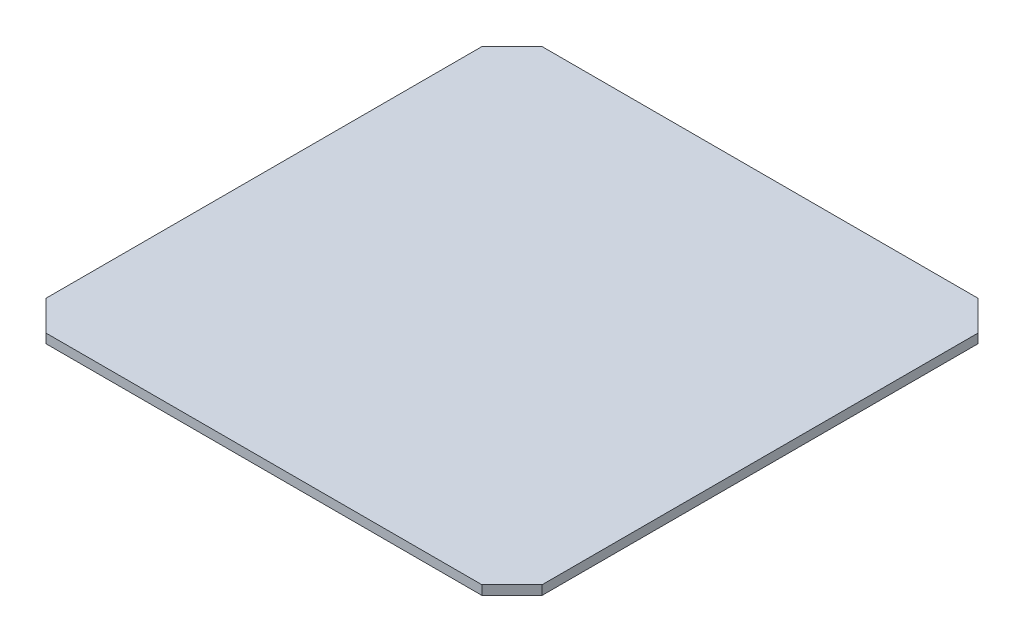
ISO-10303-21;
HEADER;
FILE_DESCRIPTION(('STEP AP214'),'2;1');
FILE_NAME('part.step','',(''),(''),'','','');
FILE_SCHEMA(('AUTOMOTIVE_DESIGN { 1 0 10303 214 1 1 1 1 }'));
ENDSEC;
DATA;
#1=APPLICATION_CONTEXT('core data for automotive mechanical design processes');
#2=APPLICATION_PROTOCOL_DEFINITION('international standard','automotive_design',2000,#1);
#3=PRODUCT_CONTEXT('',#1,'mechanical');
#4=PRODUCT('Part','Part','',(#3));
#5=PRODUCT_RELATED_PRODUCT_CATEGORY('part','',(#4));
#6=PRODUCT_DEFINITION_FORMATION('','',#4);
#7=PRODUCT_DEFINITION_CONTEXT('part definition',#1,'design');
#8=PRODUCT_DEFINITION('design','',#6,#7);
#9=PRODUCT_DEFINITION_SHAPE('','',#8);
#10=(LENGTH_UNIT() NAMED_UNIT(*) SI_UNIT(.MILLI.,.METRE.));
#11=(NAMED_UNIT(*) PLANE_ANGLE_UNIT() SI_UNIT($,.RADIAN.));
#12=(NAMED_UNIT(*) SI_UNIT($,.STERADIAN.) SOLID_ANGLE_UNIT());
#13=UNCERTAINTY_MEASURE_WITH_UNIT(LENGTH_MEASURE(1.E-05),#10,'distance_accuracy_value','');
#14=(GEOMETRIC_REPRESENTATION_CONTEXT(3) GLOBAL_UNCERTAINTY_ASSIGNED_CONTEXT((#13)) GLOBAL_UNIT_ASSIGNED_CONTEXT((#10,
#11,#12)) REPRESENTATION_CONTEXT('',''));
#15=CARTESIAN_POINT('',(0.,0.,0.));
#16=DIRECTION('',(0.,0.,1.));
#17=DIRECTION('',(1.,0.,0.));
#18=AXIS2_PLACEMENT_3D('',#15,#16,#17);
#19=CARTESIAN_POINT('',(107.,4.,107.));
#20=DIRECTION('',(-1.,0.,0.));
#21=DIRECTION('',(0.,0.,1.));
#22=AXIS2_PLACEMENT_3D('',#19,#20,#21);
#23=PLANE('',#22);
#24=DIRECTION('',(0.,0.,-1.));
#25=VECTOR('',#24,1.);
#26=CARTESIAN_POINT('',(107.,0.,107.));
#27=LINE('',#26,#25);
#28=CARTESIAN_POINT('',(107.,0.,94.));
#29=VERTEX_POINT('',#28);
#30=CARTESIAN_POINT('',(107.,0.,-94.));
#31=VERTEX_POINT('',#30);
#32=EDGE_CURVE('E131',#29,#31,#27,.T.);
#33=ORIENTED_EDGE('',*,*,#32,.T.);
#34=DIRECTION('',(0.,1.,0.));
#35=VECTOR('',#34,1.);
#36=CARTESIAN_POINT('',(107.,4.,-94.));
#37=LINE('',#36,#35);
#38=CARTESIAN_POINT('',(107.,4.,-94.));
#39=VERTEX_POINT('',#38);
#40=EDGE_CURVE('E154',#31,#39,#37,.T.);
#41=ORIENTED_EDGE('',*,*,#40,.T.);
#42=DIRECTION('',(0.,0.,-1.));
#43=VECTOR('',#42,1.);
#44=CARTESIAN_POINT('',(107.,4.,107.));
#45=LINE('',#44,#43);
#46=CARTESIAN_POINT('',(107.,4.,94.));
#47=VERTEX_POINT('',#46);
#48=EDGE_CURVE('E129',#47,#39,#45,.T.);
#49=ORIENTED_EDGE('',*,*,#48,.F.);
#50=DIRECTION('',(0.,-1.,0.));
#51=VECTOR('',#50,1.);
#52=CARTESIAN_POINT('',(107.,4.,94.));
#53=LINE('',#52,#51);
#54=EDGE_CURVE('E151',#47,#29,#53,.T.);
#55=ORIENTED_EDGE('',*,*,#54,.T.);
#56=EDGE_LOOP('',(#33,#41,#49,#55));
#57=FACE_BOUND('',#56,.T.);
#58=ADVANCED_FACE('F36',(#57),#23,.F.);
#59=CARTESIAN_POINT('',(-107.,4.,-107.));
#60=DIRECTION('',(0.,0.,1.));
#61=DIRECTION('',(1.,0.,0.));
#62=AXIS2_PLACEMENT_3D('',#59,#60,#61);
#63=PLANE('',#62);
#64=DIRECTION('',(-1.,0.,0.));
#65=VECTOR('',#64,1.);
#66=CARTESIAN_POINT('',(-107.,0.,-107.));
#67=LINE('',#66,#65);
#68=CARTESIAN_POINT('',(94.,0.,-107.));
#69=VERTEX_POINT('',#68);
#70=CARTESIAN_POINT('',(-93.9999999999999,0.,-107.));
#71=VERTEX_POINT('',#70);
#72=EDGE_CURVE('E127',#69,#71,#67,.T.);
#73=ORIENTED_EDGE('',*,*,#72,.T.);
#74=DIRECTION('',(0.,1.,0.));
#75=VECTOR('',#74,1.);
#76=CARTESIAN_POINT('',(-93.9999999999999,4.,-107.));
#77=LINE('',#76,#75);
#78=CARTESIAN_POINT('',(-93.9999999999999,4.,-107.));
#79=VERTEX_POINT('',#78);
#80=EDGE_CURVE('E106',#71,#79,#77,.T.);
#81=ORIENTED_EDGE('',*,*,#80,.T.);
#82=DIRECTION('',(-1.,0.,0.));
#83=VECTOR('',#82,1.);
#84=CARTESIAN_POINT('',(-107.,4.,-107.));
#85=LINE('',#84,#83);
#86=CARTESIAN_POINT('',(94.,4.,-107.));
#87=VERTEX_POINT('',#86);
#88=EDGE_CURVE('E170',#87,#79,#85,.T.);
#89=ORIENTED_EDGE('',*,*,#88,.F.);
#90=DIRECTION('',(0.,-1.,0.));
#91=VECTOR('',#90,1.);
#92=CARTESIAN_POINT('',(94.,4.,-107.));
#93=LINE('',#92,#91);
#94=EDGE_CURVE('E111',#87,#69,#93,.T.);
#95=ORIENTED_EDGE('',*,*,#94,.T.);
#96=EDGE_LOOP('',(#73,#81,#89,#95));
#97=FACE_BOUND('',#96,.T.);
#98=ADVANCED_FACE('F187',(#97),#63,.F.);
#99=CARTESIAN_POINT('',(-107.,4.,107.));
#100=DIRECTION('',(1.,0.,0.));
#101=DIRECTION('',(0.,0.,-1.));
#102=AXIS2_PLACEMENT_3D('',#99,#100,#101);
#103=PLANE('',#102);
#104=DIRECTION('',(0.,0.,1.));
#105=VECTOR('',#104,1.);
#106=CARTESIAN_POINT('',(-107.,4.,107.));
#107=LINE('',#106,#105);
#108=CARTESIAN_POINT('',(-107.,4.,-94.));
#109=VERTEX_POINT('',#108);
#110=CARTESIAN_POINT('',(-107.,4.,94.));
#111=VERTEX_POINT('',#110);
#112=EDGE_CURVE('E120',#109,#111,#107,.T.);
#113=ORIENTED_EDGE('',*,*,#112,.F.);
#114=DIRECTION('',(0.,-1.,0.));
#115=VECTOR('',#114,1.);
#116=CARTESIAN_POINT('',(-107.,4.,-94.));
#117=LINE('',#116,#115);
#118=CARTESIAN_POINT('',(-107.,0.,-94.));
#119=VERTEX_POINT('',#118);
#120=EDGE_CURVE('E105',#109,#119,#117,.T.);
#121=ORIENTED_EDGE('',*,*,#120,.T.);
#122=DIRECTION('',(0.,0.,1.));
#123=VECTOR('',#122,1.);
#124=CARTESIAN_POINT('',(-107.,0.,107.));
#125=LINE('',#124,#123);
#126=CARTESIAN_POINT('',(-107.,0.,94.));
#127=VERTEX_POINT('',#126);
#128=EDGE_CURVE('E118',#119,#127,#125,.T.);
#129=ORIENTED_EDGE('',*,*,#128,.T.);
#130=DIRECTION('',(0.,1.,0.));
#131=VECTOR('',#130,1.);
#132=CARTESIAN_POINT('',(-107.,4.,94.));
#133=LINE('',#132,#131);
#134=EDGE_CURVE('E122',#127,#111,#133,.T.);
#135=ORIENTED_EDGE('',*,*,#134,.T.);
#136=EDGE_LOOP('',(#113,#121,#129,#135));
#137=FACE_BOUND('',#136,.T.);
#138=ADVANCED_FACE('F117',(#137),#103,.F.);
#139=CARTESIAN_POINT('',(-107.,4.,107.));
#140=DIRECTION('',(0.,0.,-1.));
#141=DIRECTION('',(-1.,0.,0.));
#142=AXIS2_PLACEMENT_3D('',#139,#140,#141);
#143=PLANE('',#142);
#144=DIRECTION('',(1.,0.,0.));
#145=VECTOR('',#144,1.);
#146=CARTESIAN_POINT('',(-107.,0.,107.));
#147=LINE('',#146,#145);
#148=CARTESIAN_POINT('',(-94.,0.,107.));
#149=VERTEX_POINT('',#148);
#150=CARTESIAN_POINT('',(94.,0.,107.));
#151=VERTEX_POINT('',#150);
#152=EDGE_CURVE('E126',#149,#151,#147,.T.);
#153=ORIENTED_EDGE('',*,*,#152,.T.);
#154=DIRECTION('',(0.,1.,0.));
#155=VECTOR('',#154,1.);
#156=CARTESIAN_POINT('',(94.,4.,107.));
#157=LINE('',#156,#155);
#158=CARTESIAN_POINT('',(94.,4.,107.));
#159=VERTEX_POINT('',#158);
#160=EDGE_CURVE('E11',#151,#159,#157,.T.);
#161=ORIENTED_EDGE('',*,*,#160,.T.);
#162=DIRECTION('',(1.,0.,0.));
#163=VECTOR('',#162,1.);
#164=CARTESIAN_POINT('',(-107.,4.,107.));
#165=LINE('',#164,#163);
#166=CARTESIAN_POINT('',(-94.,4.,107.));
#167=VERTEX_POINT('',#166);
#168=EDGE_CURVE('E135',#167,#159,#165,.T.);
#169=ORIENTED_EDGE('',*,*,#168,.F.);
#170=DIRECTION('',(0.,-1.,0.));
#171=VECTOR('',#170,1.);
#172=CARTESIAN_POINT('',(-94.,4.,107.));
#173=LINE('',#172,#171);
#174=EDGE_CURVE('E44',#167,#149,#173,.T.);
#175=ORIENTED_EDGE('',*,*,#174,.T.);
#176=EDGE_LOOP('',(#153,#161,#169,#175));
#177=FACE_BOUND('',#176,.T.);
#178=ADVANCED_FACE('F157',(#177),#143,.F.);
#179=CARTESIAN_POINT('',(0.,4.,0.));
#180=DIRECTION('',(0.,-1.,0.));
#181=DIRECTION('',(0.,0.,-1.));
#182=AXIS2_PLACEMENT_3D('',#179,#180,#181);
#183=PLANE('',#182);
#184=ORIENTED_EDGE('',*,*,#88,.T.);
#185=DIRECTION('',(0.707106781186548,0.,-0.707106781186547));
#186=VECTOR('',#185,1.);
#187=CARTESIAN_POINT('',(-107.,4.,-94.));
#188=LINE('',#187,#186);
#189=EDGE_CURVE('E149',#79,#109,#188,.F.);
#190=ORIENTED_EDGE('',*,*,#189,.T.);
#191=ORIENTED_EDGE('',*,*,#112,.T.);
#192=DIRECTION('',(-0.707106781186546,0.,-0.707106781186549));
#193=VECTOR('',#192,1.);
#194=CARTESIAN_POINT('',(-94.,4.,107.));
#195=LINE('',#194,#193);
#196=EDGE_CURVE('E56',#111,#167,#195,.F.);
#197=ORIENTED_EDGE('',*,*,#196,.T.);
#198=ORIENTED_EDGE('',*,*,#168,.T.);
#199=DIRECTION('',(-0.707106781186549,0.,0.707106781186546));
#200=VECTOR('',#199,1.);
#201=CARTESIAN_POINT('',(107.,4.,94.));
#202=LINE('',#201,#200);
#203=EDGE_CURVE('E145',#159,#47,#202,.F.);
#204=ORIENTED_EDGE('',*,*,#203,.T.);
#205=ORIENTED_EDGE('',*,*,#48,.T.);
#206=DIRECTION('',(0.707106781186547,0.,0.707106781186548));
#207=VECTOR('',#206,1.);
#208=CARTESIAN_POINT('',(94.,4.,-107.));
#209=LINE('',#208,#207);
#210=EDGE_CURVE('E147',#39,#87,#209,.F.);
#211=ORIENTED_EDGE('',*,*,#210,.T.);
#212=EDGE_LOOP('',(#184,#190,#191,#197,#198,#204,#205,#211));
#213=FACE_BOUND('',#212,.T.);
#214=ADVANCED_FACE('F176',(#213),#183,.F.);
#215=CARTESIAN_POINT('',(0.,0.,0.));
#216=DIRECTION('',(0.,-1.,0.));
#217=DIRECTION('',(0.,0.,-1.));
#218=AXIS2_PLACEMENT_3D('',#215,#216,#217);
#219=PLANE('',#218);
#220=ORIENTED_EDGE('',*,*,#128,.F.);
#221=DIRECTION('',(-0.707106781186548,0.,0.707106781186547));
#222=VECTOR('',#221,1.);
#223=CARTESIAN_POINT('',(-100.5,0.,-100.5));
#224=LINE('',#223,#222);
#225=EDGE_CURVE('E101',#119,#71,#224,.F.);
#226=ORIENTED_EDGE('',*,*,#225,.T.);
#227=ORIENTED_EDGE('',*,*,#72,.F.);
#228=DIRECTION('',(-0.707106781186547,0.,-0.707106781186548));
#229=VECTOR('',#228,1.);
#230=CARTESIAN_POINT('',(100.5,0.,-100.5));
#231=LINE('',#230,#229);
#232=EDGE_CURVE('E112',#69,#31,#231,.F.);
#233=ORIENTED_EDGE('',*,*,#232,.T.);
#234=ORIENTED_EDGE('',*,*,#32,.F.);
#235=DIRECTION('',(0.707106781186549,0.,-0.707106781186546));
#236=VECTOR('',#235,1.);
#237=CARTESIAN_POINT('',(100.5,0.,100.5));
#238=LINE('',#237,#236);
#239=EDGE_CURVE('E138',#29,#151,#238,.F.);
#240=ORIENTED_EDGE('',*,*,#239,.T.);
#241=ORIENTED_EDGE('',*,*,#152,.F.);
#242=DIRECTION('',(0.707106781186546,0.,0.707106781186549));
#243=VECTOR('',#242,1.);
#244=CARTESIAN_POINT('',(-100.5,0.,100.5));
#245=LINE('',#244,#243);
#246=EDGE_CURVE('E121',#149,#127,#245,.F.);
#247=ORIENTED_EDGE('',*,*,#246,.T.);
#248=EDGE_LOOP('',(#220,#226,#227,#233,#234,#240,#241,#247));
#249=FACE_BOUND('',#248,.T.);
#250=ADVANCED_FACE('F124',(#249),#219,.T.);
#251=CARTESIAN_POINT('',(-107.,4.,-94.));
#252=DIRECTION('',(0.707106781186547,0.,0.707106781186548));
#253=DIRECTION('',(0.,-1.,0.));
#254=AXIS2_PLACEMENT_3D('',#251,#252,#253);
#255=PLANE('',#254);
#256=ORIENTED_EDGE('',*,*,#189,.F.);
#257=ORIENTED_EDGE('',*,*,#80,.F.);
#258=ORIENTED_EDGE('',*,*,#225,.F.);
#259=ORIENTED_EDGE('',*,*,#120,.F.);
#260=EDGE_LOOP('',(#256,#257,#258,#259));
#261=FACE_BOUND('',#260,.T.);
#262=ADVANCED_FACE('F104',(#261),#255,.F.);
#263=CARTESIAN_POINT('',(94.,4.,-107.));
#264=DIRECTION('',(-0.707106781186548,0.,0.707106781186547));
#265=DIRECTION('',(0.,-1.,0.));
#266=AXIS2_PLACEMENT_3D('',#263,#264,#265);
#267=PLANE('',#266);
#268=ORIENTED_EDGE('',*,*,#210,.F.);
#269=ORIENTED_EDGE('',*,*,#40,.F.);
#270=ORIENTED_EDGE('',*,*,#232,.F.);
#271=ORIENTED_EDGE('',*,*,#94,.F.);
#272=EDGE_LOOP('',(#268,#269,#270,#271));
#273=FACE_BOUND('',#272,.T.);
#274=ADVANCED_FACE('F198',(#273),#267,.F.);
#275=CARTESIAN_POINT('',(107.,4.,94.));
#276=DIRECTION('',(-0.707106781186546,0.,-0.707106781186549));
#277=DIRECTION('',(0.,-1.,0.));
#278=AXIS2_PLACEMENT_3D('',#275,#276,#277);
#279=PLANE('',#278);
#280=ORIENTED_EDGE('',*,*,#203,.F.);
#281=ORIENTED_EDGE('',*,*,#160,.F.);
#282=ORIENTED_EDGE('',*,*,#239,.F.);
#283=ORIENTED_EDGE('',*,*,#54,.F.);
#284=EDGE_LOOP('',(#280,#281,#282,#283));
#285=FACE_BOUND('',#284,.T.);
#286=ADVANCED_FACE('F164',(#285),#279,.F.);
#287=CARTESIAN_POINT('',(-94.,4.,107.));
#288=DIRECTION('',(0.707106781186549,0.,-0.707106781186546));
#289=DIRECTION('',(0.,-1.,0.));
#290=AXIS2_PLACEMENT_3D('',#287,#288,#289);
#291=PLANE('',#290);
#292=ORIENTED_EDGE('',*,*,#196,.F.);
#293=ORIENTED_EDGE('',*,*,#134,.F.);
#294=ORIENTED_EDGE('',*,*,#246,.F.);
#295=ORIENTED_EDGE('',*,*,#174,.F.);
#296=EDGE_LOOP('',(#292,#293,#294,#295));
#297=FACE_BOUND('',#296,.T.);
#298=ADVANCED_FACE('F38',(#297),#291,.F.);
#299=CLOSED_SHELL('',(#58,#98,#138,#178,#214,#250,#262,#274,#286,#298));
#300=MANIFOLD_SOLID_BREP('B2',#299);
#301=ADVANCED_BREP_SHAPE_REPRESENTATION('',(#18,#300),#14);
#302=SHAPE_DEFINITION_REPRESENTATION(#9,#301);
ENDSEC;
END-ISO-10303-21;
